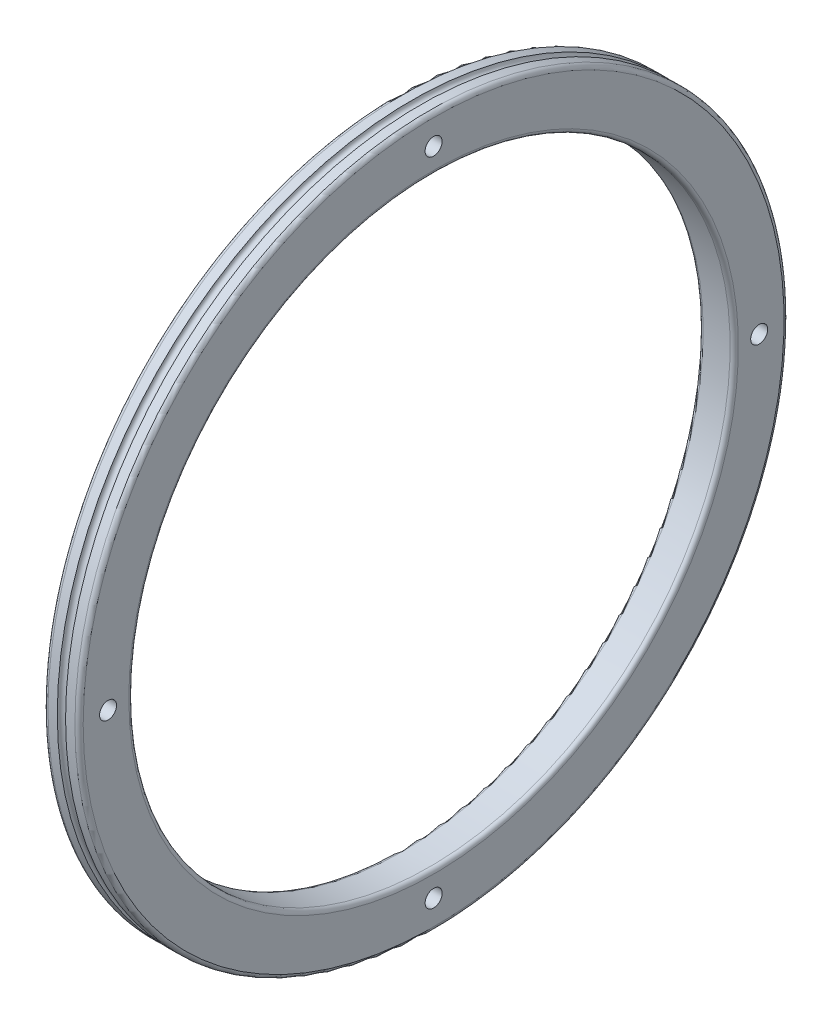
ISO-10303-21;
HEADER;
FILE_DESCRIPTION(('STEP AP214'),'2;1');
FILE_NAME('part.step','',(''),(''),'','','');
FILE_SCHEMA(('AUTOMOTIVE_DESIGN { 1 0 10303 214 1 1 1 1 }'));
ENDSEC;
DATA;
#1=APPLICATION_CONTEXT('core data for automotive mechanical design processes');
#2=APPLICATION_PROTOCOL_DEFINITION('international standard','automotive_design',2000,#1);
#3=PRODUCT_CONTEXT('',#1,'mechanical');
#4=PRODUCT('Part','Part','',(#3));
#5=PRODUCT_RELATED_PRODUCT_CATEGORY('part','',(#4));
#6=PRODUCT_DEFINITION_FORMATION('','',#4);
#7=PRODUCT_DEFINITION_CONTEXT('part definition',#1,'design');
#8=PRODUCT_DEFINITION('design','',#6,#7);
#9=PRODUCT_DEFINITION_SHAPE('','',#8);
#10=(LENGTH_UNIT() NAMED_UNIT(*) SI_UNIT(.MILLI.,.METRE.));
#11=(NAMED_UNIT(*) PLANE_ANGLE_UNIT() SI_UNIT($,.RADIAN.));
#12=(NAMED_UNIT(*) SI_UNIT($,.STERADIAN.) SOLID_ANGLE_UNIT());
#13=UNCERTAINTY_MEASURE_WITH_UNIT(LENGTH_MEASURE(1.E-05),#10,'distance_accuracy_value','');
#14=(GEOMETRIC_REPRESENTATION_CONTEXT(3) GLOBAL_UNCERTAINTY_ASSIGNED_CONTEXT((#13)) GLOBAL_UNIT_ASSIGNED_CONTEXT((#10,
#11,#12)) REPRESENTATION_CONTEXT('',''));
#15=CARTESIAN_POINT('',(0.,0.,0.));
#16=DIRECTION('',(0.,0.,1.));
#17=DIRECTION('',(1.,0.,0.));
#18=AXIS2_PLACEMENT_3D('',#15,#16,#17);
#19=CARTESIAN_POINT('',(-4.24999999999999,0.,-72.5));
#20=DIRECTION('',(1.,0.,0.));
#21=DIRECTION('',(0.,0.,-1.));
#22=AXIS2_PLACEMENT_3D('',#19,#20,#21);
#23=PLANE('',#22);
#24=CARTESIAN_POINT('',(-4.24999999999999,0.,78.5));
#25=DIRECTION('',(1.,0.,0.));
#26=DIRECTION('',(0.,0.,-1.));
#27=AXIS2_PLACEMENT_3D('',#24,#25,#26);
#28=CIRCLE('',#27,2.04999999999999);
#29=CARTESIAN_POINT('',(-4.24999999999999,0.,76.45));
#30=VERTEX_POINT('',#29);
#31=EDGE_CURVE('E85',#30,#30,#28,.F.);
#32=ORIENTED_EDGE('',*,*,#31,.F.);
#33=EDGE_LOOP('',(#32));
#34=FACE_BOUND('',#33,.T.);
#35=CARTESIAN_POINT('',(-4.24999999999999,78.5,-2.74081285099186E-13));
#36=DIRECTION('',(1.,0.,0.));
#37=DIRECTION('',(0.,0.,-1.));
#38=AXIS2_PLACEMENT_3D('',#35,#36,#37);
#39=CIRCLE('',#38,2.04999999999999);
#40=CARTESIAN_POINT('',(-4.24999999999999,78.5,-2.05000000000026));
#41=VERTEX_POINT('',#40);
#42=EDGE_CURVE('E103',#41,#41,#39,.F.);
#43=ORIENTED_EDGE('',*,*,#42,.F.);
#44=EDGE_LOOP('',(#43));
#45=FACE_BOUND('',#44,.T.);
#46=CARTESIAN_POINT('',(-4.24999999999999,-5.48162570198372E-13,-78.5));
#47=DIRECTION('',(1.,0.,0.));
#48=DIRECTION('',(0.,0.,-1.));
#49=AXIS2_PLACEMENT_3D('',#46,#47,#48);
#50=CIRCLE('',#49,2.04999999999999);
#51=CARTESIAN_POINT('',(-4.24999999999999,-5.48162570198372E-13,-80.55));
#52=VERTEX_POINT('',#51);
#53=EDGE_CURVE('E95',#52,#52,#50,.F.);
#54=ORIENTED_EDGE('',*,*,#53,.F.);
#55=EDGE_LOOP('',(#54));
#56=FACE_BOUND('',#55,.T.);
#57=CARTESIAN_POINT('',(-4.24999999999999,-78.5,8.22243855297558E-13));
#58=DIRECTION('',(1.,0.,0.));
#59=DIRECTION('',(0.,0.,-1.));
#60=AXIS2_PLACEMENT_3D('',#57,#58,#59);
#61=CIRCLE('',#60,2.04999999999999);
#62=CARTESIAN_POINT('',(-4.24999999999999,-78.5,-2.04999999999916));
#63=VERTEX_POINT('',#62);
#64=EDGE_CURVE('E86',#63,#63,#61,.F.);
#65=ORIENTED_EDGE('',*,*,#64,.F.);
#66=EDGE_LOOP('',(#65));
#67=FACE_BOUND('',#66,.T.);
#68=CARTESIAN_POINT('',(-4.24999999999999,0.,0.));
#69=DIRECTION('',(1.,0.,0.));
#70=DIRECTION('',(0.,0.,-1.));
#71=AXIS2_PLACEMENT_3D('',#68,#69,#70);
#72=CIRCLE('',#71,84.5);
#73=CARTESIAN_POINT('',(-4.24999999999999,0.,-84.5));
#74=VERTEX_POINT('',#73);
#75=EDGE_CURVE('E69',#74,#74,#72,.F.);
#76=ORIENTED_EDGE('',*,*,#75,.T.);
#77=EDGE_LOOP('',(#76));
#78=FACE_BOUND('',#77,.T.);
#79=CARTESIAN_POINT('',(-4.24999999999999,0.,0.));
#80=DIRECTION('',(1.,0.,0.));
#81=DIRECTION('',(0.,0.,-1.));
#82=AXIS2_PLACEMENT_3D('',#79,#80,#81);
#83=CIRCLE('',#82,73.5);
#84=CARTESIAN_POINT('',(-4.24999999999999,0.,-73.5));
#85=VERTEX_POINT('',#84);
#86=EDGE_CURVE('E73',#85,#85,#83,.T.);
#87=ORIENTED_EDGE('',*,*,#86,.T.);
#88=EDGE_LOOP('',(#87));
#89=FACE_BOUND('',#88,.T.);
#90=ADVANCED_FACE('F37',(#34,#45,#56,#67,#78,#89),#23,.F.);
#91=CARTESIAN_POINT('',(-9.3632213840996,0.,0.));
#92=DIRECTION('',(-1.,0.,0.));
#93=DIRECTION('',(0.,0.,1.));
#94=AXIS2_PLACEMENT_3D('',#91,#92,#93);
#95=CYLINDRICAL_SURFACE('',#94,72.5);
#96=CARTESIAN_POINT('',(-3.24999999999999,0.,0.));
#97=DIRECTION('',(1.,0.,0.));
#98=DIRECTION('',(0.,0.,-1.));
#99=AXIS2_PLACEMENT_3D('',#96,#97,#98);
#100=CIRCLE('',#99,72.5);
#101=CARTESIAN_POINT('',(-3.24999999999999,0.,-72.5));
#102=VERTEX_POINT('',#101);
#103=EDGE_CURVE('E10',#102,#102,#100,.F.);
#104=ORIENTED_EDGE('',*,*,#103,.T.);
#105=EDGE_LOOP('',(#104));
#106=FACE_BOUND('',#105,.T.);
#107=CARTESIAN_POINT('',(3.25000000000001,0.,0.));
#108=DIRECTION('',(-1.,0.,0.));
#109=DIRECTION('',(0.,0.,1.));
#110=AXIS2_PLACEMENT_3D('',#107,#108,#109);
#111=CIRCLE('',#110,72.5);
#112=CARTESIAN_POINT('',(3.25000000000001,0.,72.5));
#113=VERTEX_POINT('',#112);
#114=EDGE_CURVE('E45',#113,#113,#111,.F.);
#115=ORIENTED_EDGE('',*,*,#114,.T.);
#116=EDGE_LOOP('',(#115));
#117=FACE_BOUND('',#116,.T.);
#118=ADVANCED_FACE('F125',(#106,#117),#95,.F.);
#119=CARTESIAN_POINT('',(4.25000000000001,0.,-85.5));
#120=DIRECTION('',(-1.,0.,0.));
#121=DIRECTION('',(0.,0.,1.));
#122=AXIS2_PLACEMENT_3D('',#119,#120,#121);
#123=PLANE('',#122);
#124=CARTESIAN_POINT('',(4.25000000000001,0.,78.5));
#125=DIRECTION('',(1.,0.,0.));
#126=DIRECTION('',(0.,0.,-1.));
#127=AXIS2_PLACEMENT_3D('',#124,#125,#126);
#128=CIRCLE('',#127,2.04999999999999);
#129=CARTESIAN_POINT('',(4.25000000000001,0.,76.45));
#130=VERTEX_POINT('',#129);
#131=EDGE_CURVE('E107',#130,#130,#128,.T.);
#132=ORIENTED_EDGE('',*,*,#131,.F.);
#133=EDGE_LOOP('',(#132));
#134=FACE_BOUND('',#133,.T.);
#135=CARTESIAN_POINT('',(4.25000000000001,78.5,-2.74081285099186E-13));
#136=DIRECTION('',(1.,0.,0.));
#137=DIRECTION('',(0.,0.,-1.));
#138=AXIS2_PLACEMENT_3D('',#135,#136,#137);
#139=CIRCLE('',#138,2.04999999999999);
#140=CARTESIAN_POINT('',(4.25000000000001,78.5,-2.05000000000026));
#141=VERTEX_POINT('',#140);
#142=EDGE_CURVE('E99',#141,#141,#139,.T.);
#143=ORIENTED_EDGE('',*,*,#142,.F.);
#144=EDGE_LOOP('',(#143));
#145=FACE_BOUND('',#144,.T.);
#146=CARTESIAN_POINT('',(4.25000000000001,-5.48162570198372E-13,-78.5));
#147=DIRECTION('',(1.,0.,0.));
#148=DIRECTION('',(0.,0.,-1.));
#149=AXIS2_PLACEMENT_3D('',#146,#147,#148);
#150=CIRCLE('',#149,2.04999999999999);
#151=CARTESIAN_POINT('',(4.25000000000001,-5.48162570198372E-13,-80.55));
#152=VERTEX_POINT('',#151);
#153=EDGE_CURVE('E90',#152,#152,#150,.T.);
#154=ORIENTED_EDGE('',*,*,#153,.F.);
#155=EDGE_LOOP('',(#154));
#156=FACE_BOUND('',#155,.T.);
#157=CARTESIAN_POINT('',(4.25000000000001,-78.5,8.22243855297558E-13));
#158=DIRECTION('',(1.,0.,0.));
#159=DIRECTION('',(0.,0.,-1.));
#160=AXIS2_PLACEMENT_3D('',#157,#158,#159);
#161=CIRCLE('',#160,2.04999999999999);
#162=CARTESIAN_POINT('',(4.25000000000001,-78.5,-2.04999999999916));
#163=VERTEX_POINT('',#162);
#164=EDGE_CURVE('E91',#163,#163,#161,.T.);
#165=ORIENTED_EDGE('',*,*,#164,.F.);
#166=EDGE_LOOP('',(#165));
#167=FACE_BOUND('',#166,.T.);
#168=CARTESIAN_POINT('',(4.25000000000001,0.,0.));
#169=DIRECTION('',(-1.,0.,0.));
#170=DIRECTION('',(0.,0.,1.));
#171=AXIS2_PLACEMENT_3D('',#168,#169,#170);
#172=CIRCLE('',#171,84.5);
#173=CARTESIAN_POINT('',(4.25000000000001,0.,84.5));
#174=VERTEX_POINT('',#173);
#175=EDGE_CURVE('E50',#174,#174,#172,.F.);
#176=ORIENTED_EDGE('',*,*,#175,.T.);
#177=EDGE_LOOP('',(#176));
#178=FACE_BOUND('',#177,.T.);
#179=CARTESIAN_POINT('',(4.25000000000001,0.,0.));
#180=DIRECTION('',(-1.,0.,0.));
#181=DIRECTION('',(0.,0.,1.));
#182=AXIS2_PLACEMENT_3D('',#179,#180,#181);
#183=CIRCLE('',#182,73.5);
#184=CARTESIAN_POINT('',(4.25000000000001,0.,73.5));
#185=VERTEX_POINT('',#184);
#186=EDGE_CURVE('E55',#185,#185,#183,.T.);
#187=ORIENTED_EDGE('',*,*,#186,.T.);
#188=EDGE_LOOP('',(#187));
#189=FACE_BOUND('',#188,.T.);
#190=ADVANCED_FACE('F121',(#134,#145,#156,#167,#178,#189),#123,.F.);
#191=CARTESIAN_POINT('',(-9.3632213840996,0.,0.));
#192=DIRECTION('',(-1.,0.,0.));
#193=DIRECTION('',(0.,0.,1.));
#194=AXIS2_PLACEMENT_3D('',#191,#192,#193);
#195=CYLINDRICAL_SURFACE('',#194,85.5);
#196=CARTESIAN_POINT('',(3.25000000000001,0.,0.));
#197=DIRECTION('',(-1.,0.,0.));
#198=DIRECTION('',(0.,0.,1.));
#199=AXIS2_PLACEMENT_3D('',#196,#197,#198);
#200=CIRCLE('',#199,85.5);
#201=CARTESIAN_POINT('',(3.25000000000001,0.,85.5));
#202=VERTEX_POINT('',#201);
#203=EDGE_CURVE('E61',#202,#202,#200,.T.);
#204=ORIENTED_EDGE('',*,*,#203,.T.);
#205=EDGE_LOOP('',(#204));
#206=FACE_BOUND('',#205,.T.);
#207=CARTESIAN_POINT('',(0.998931618832478,0.,0.));
#208=DIRECTION('',(-1.,0.,0.));
#209=DIRECTION('',(0.,0.,1.));
#210=AXIS2_PLACEMENT_3D('',#207,#208,#209);
#211=CIRCLE('',#210,85.5);
#212=CARTESIAN_POINT('',(0.998931618832478,0.,85.5));
#213=VERTEX_POINT('',#212);
#214=EDGE_CURVE('E77',#213,#213,#211,.T.);
#215=ORIENTED_EDGE('',*,*,#214,.F.);
#216=EDGE_LOOP('',(#215));
#217=FACE_BOUND('',#216,.T.);
#218=ADVANCED_FACE('F124',(#206,#217),#195,.T.);
#219=CARTESIAN_POINT('',(0.,0.,0.));
#220=DIRECTION('',(-1.,0.,0.));
#221=DIRECTION('',(0.,0.,1.));
#222=AXIS2_PLACEMENT_3D('',#219,#220,#221);
#223=TOROIDAL_SURFACE('',#222,85.4537872214996,0.999999999999993);
#224=CARTESIAN_POINT('',(-0.998931618832471,0.,0.));
#225=DIRECTION('',(-1.,0.,0.));
#226=DIRECTION('',(0.,0.,1.));
#227=AXIS2_PLACEMENT_3D('',#224,#225,#226);
#228=CIRCLE('',#227,85.5);
#229=CARTESIAN_POINT('',(-0.998931618832471,0.,85.5));
#230=VERTEX_POINT('',#229);
#231=EDGE_CURVE('E81',#230,#230,#228,.T.);
#232=ORIENTED_EDGE('',*,*,#231,.F.);
#233=EDGE_LOOP('',(#232));
#234=FACE_BOUND('',#233,.T.);
#235=ORIENTED_EDGE('',*,*,#214,.T.);
#236=EDGE_LOOP('',(#235));
#237=FACE_BOUND('',#236,.T.);
#238=ADVANCED_FACE('F174',(#234,#237),#223,.F.);
#239=CARTESIAN_POINT('',(-9.3632213840996,0.,0.));
#240=DIRECTION('',(-1.,0.,0.));
#241=DIRECTION('',(0.,0.,1.));
#242=AXIS2_PLACEMENT_3D('',#239,#240,#241);
#243=CYLINDRICAL_SURFACE('',#242,85.5);
#244=CARTESIAN_POINT('',(-3.24999999999999,0.,0.));
#245=DIRECTION('',(1.,0.,0.));
#246=DIRECTION('',(0.,0.,-1.));
#247=AXIS2_PLACEMENT_3D('',#244,#245,#246);
#248=CIRCLE('',#247,85.5);
#249=CARTESIAN_POINT('',(-3.24999999999999,0.,-85.5));
#250=VERTEX_POINT('',#249);
#251=EDGE_CURVE('E65',#250,#250,#248,.T.);
#252=ORIENTED_EDGE('',*,*,#251,.T.);
#253=EDGE_LOOP('',(#252));
#254=FACE_BOUND('',#253,.T.);
#255=ORIENTED_EDGE('',*,*,#231,.T.);
#256=EDGE_LOOP('',(#255));
#257=FACE_BOUND('',#256,.T.);
#258=ADVANCED_FACE('F163',(#254,#257),#243,.T.);
#259=CARTESIAN_POINT('',(-3.24999999999999,0.,0.));
#260=DIRECTION('',(1.,0.,0.));
#261=DIRECTION('',(0.,0.,-1.));
#262=AXIS2_PLACEMENT_3D('',#259,#260,#261);
#263=TOROIDAL_SURFACE('',#262,84.5,1.);
#264=ORIENTED_EDGE('',*,*,#251,.F.);
#265=EDGE_LOOP('',(#264));
#266=FACE_BOUND('',#265,.T.);
#267=ORIENTED_EDGE('',*,*,#75,.F.);
#268=EDGE_LOOP('',(#267));
#269=FACE_BOUND('',#268,.T.);
#270=ADVANCED_FACE('F160',(#266,#269),#263,.T.);
#271=CARTESIAN_POINT('',(3.25000000000001,0.,0.));
#272=DIRECTION('',(-1.,0.,0.));
#273=DIRECTION('',(0.,0.,1.));
#274=AXIS2_PLACEMENT_3D('',#271,#272,#273);
#275=TOROIDAL_SURFACE('',#274,84.5,1.);
#276=ORIENTED_EDGE('',*,*,#175,.F.);
#277=EDGE_LOOP('',(#276));
#278=FACE_BOUND('',#277,.T.);
#279=ORIENTED_EDGE('',*,*,#203,.F.);
#280=EDGE_LOOP('',(#279));
#281=FACE_BOUND('',#280,.T.);
#282=ADVANCED_FACE('F148',(#278,#281),#275,.T.);
#283=CARTESIAN_POINT('',(-3.24999999999999,0.,0.));
#284=DIRECTION('',(1.,0.,0.));
#285=DIRECTION('',(0.,0.,-1.));
#286=AXIS2_PLACEMENT_3D('',#283,#284,#285);
#287=TOROIDAL_SURFACE('',#286,73.5,1.);
#288=ORIENTED_EDGE('',*,*,#86,.F.);
#289=EDGE_LOOP('',(#288));
#290=FACE_BOUND('',#289,.T.);
#291=ORIENTED_EDGE('',*,*,#103,.F.);
#292=EDGE_LOOP('',(#291));
#293=FACE_BOUND('',#292,.T.);
#294=ADVANCED_FACE('F139',(#290,#293),#287,.T.);
#295=CARTESIAN_POINT('',(3.25000000000001,0.,0.));
#296=DIRECTION('',(-1.,0.,0.));
#297=DIRECTION('',(0.,0.,1.));
#298=AXIS2_PLACEMENT_3D('',#295,#296,#297);
#299=TOROIDAL_SURFACE('',#298,73.5,1.);
#300=ORIENTED_EDGE('',*,*,#114,.F.);
#301=EDGE_LOOP('',(#300));
#302=FACE_BOUND('',#301,.T.);
#303=ORIENTED_EDGE('',*,*,#186,.F.);
#304=EDGE_LOOP('',(#303));
#305=FACE_BOUND('',#304,.T.);
#306=ADVANCED_FACE('F39',(#302,#305),#299,.T.);
#307=CARTESIAN_POINT('',(-4.25099999999999,-78.5,8.22243855297558E-13));
#308=DIRECTION('',(1.,0.,0.));
#309=DIRECTION('',(0.,0.,-1.));
#310=AXIS2_PLACEMENT_3D('',#307,#308,#309);
#311=CYLINDRICAL_SURFACE('',#310,2.04999999999999);
#312=ORIENTED_EDGE('',*,*,#164,.T.);
#313=EDGE_LOOP('',(#312));
#314=FACE_BOUND('',#313,.T.);
#315=ORIENTED_EDGE('',*,*,#64,.T.);
#316=EDGE_LOOP('',(#315));
#317=FACE_BOUND('',#316,.T.);
#318=ADVANCED_FACE('F138',(#314,#317),#311,.F.);
#319=CARTESIAN_POINT('',(-4.25099999999999,-5.48162570198372E-13,-78.5));
#320=DIRECTION('',(1.,0.,0.));
#321=DIRECTION('',(0.,0.,-1.));
#322=AXIS2_PLACEMENT_3D('',#319,#320,#321);
#323=CYLINDRICAL_SURFACE('',#322,2.04999999999999);
#324=ORIENTED_EDGE('',*,*,#153,.T.);
#325=EDGE_LOOP('',(#324));
#326=FACE_BOUND('',#325,.T.);
#327=ORIENTED_EDGE('',*,*,#53,.T.);
#328=EDGE_LOOP('',(#327));
#329=FACE_BOUND('',#328,.T.);
#330=ADVANCED_FACE('F145',(#326,#329),#323,.F.);
#331=CARTESIAN_POINT('',(-4.25099999999999,78.5,-2.74081285099186E-13));
#332=DIRECTION('',(1.,0.,0.));
#333=DIRECTION('',(0.,0.,-1.));
#334=AXIS2_PLACEMENT_3D('',#331,#332,#333);
#335=CYLINDRICAL_SURFACE('',#334,2.04999999999999);
#336=ORIENTED_EDGE('',*,*,#142,.T.);
#337=EDGE_LOOP('',(#336));
#338=FACE_BOUND('',#337,.T.);
#339=ORIENTED_EDGE('',*,*,#42,.T.);
#340=EDGE_LOOP('',(#339));
#341=FACE_BOUND('',#340,.T.);
#342=ADVANCED_FACE('F190',(#338,#341),#335,.F.);
#343=CARTESIAN_POINT('',(-4.25099999999999,0.,78.5));
#344=DIRECTION('',(1.,0.,0.));
#345=DIRECTION('',(0.,0.,-1.));
#346=AXIS2_PLACEMENT_3D('',#343,#344,#345);
#347=CYLINDRICAL_SURFACE('',#346,2.04999999999999);
#348=ORIENTED_EDGE('',*,*,#131,.T.);
#349=EDGE_LOOP('',(#348));
#350=FACE_BOUND('',#349,.T.);
#351=ORIENTED_EDGE('',*,*,#31,.T.);
#352=EDGE_LOOP('',(#351));
#353=FACE_BOUND('',#352,.T.);
#354=ADVANCED_FACE('F118',(#350,#353),#347,.F.);
#355=CLOSED_SHELL('',(#90,#118,#190,#218,#238,#258,#270,#282,#294,#306,#318,#330,#342,#354));
#356=MANIFOLD_SOLID_BREP('B2',#355);
#357=ADVANCED_BREP_SHAPE_REPRESENTATION('',(#18,#356),#14);
#358=SHAPE_DEFINITION_REPRESENTATION(#9,#357);
ENDSEC;
END-ISO-10303-21;
